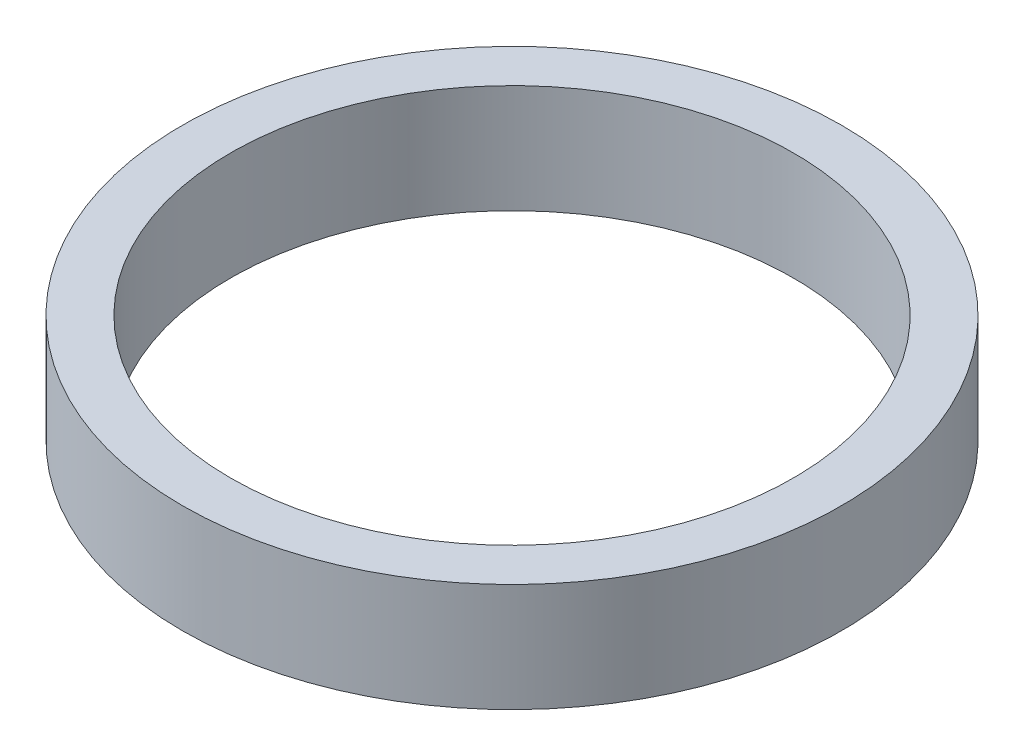
ISO-10303-21;
HEADER;
FILE_DESCRIPTION(('STEP AP214'),'2;1');
FILE_NAME('part.step','',(''),(''),'','','');
FILE_SCHEMA(('AUTOMOTIVE_DESIGN { 1 0 10303 214 1 1 1 1 }'));
ENDSEC;
DATA;
#1=APPLICATION_CONTEXT('core data for automotive mechanical design processes');
#2=APPLICATION_PROTOCOL_DEFINITION('international standard','automotive_design',2000,#1);
#3=PRODUCT_CONTEXT('',#1,'mechanical');
#4=PRODUCT('Part','Part','',(#3));
#5=PRODUCT_RELATED_PRODUCT_CATEGORY('part','',(#4));
#6=PRODUCT_DEFINITION_FORMATION('','',#4);
#7=PRODUCT_DEFINITION_CONTEXT('part definition',#1,'design');
#8=PRODUCT_DEFINITION('design','',#6,#7);
#9=PRODUCT_DEFINITION_SHAPE('','',#8);
#10=(LENGTH_UNIT() NAMED_UNIT(*) SI_UNIT(.MILLI.,.METRE.));
#11=(NAMED_UNIT(*) PLANE_ANGLE_UNIT() SI_UNIT($,.RADIAN.));
#12=(NAMED_UNIT(*) SI_UNIT($,.STERADIAN.) SOLID_ANGLE_UNIT());
#13=UNCERTAINTY_MEASURE_WITH_UNIT(LENGTH_MEASURE(1.E-05),#10,'distance_accuracy_value','');
#14=(GEOMETRIC_REPRESENTATION_CONTEXT(3) GLOBAL_UNCERTAINTY_ASSIGNED_CONTEXT((#13)) GLOBAL_UNIT_ASSIGNED_CONTEXT((#10,
#11,#12)) REPRESENTATION_CONTEXT('',''));
#15=CARTESIAN_POINT('',(0.,0.,0.));
#16=DIRECTION('',(0.,0.,1.));
#17=DIRECTION('',(1.,0.,0.));
#18=AXIS2_PLACEMENT_3D('',#15,#16,#17);
#19=CARTESIAN_POINT('',(0.,0.,0.));
#20=DIRECTION('',(0.,-1.,0.));
#21=DIRECTION('',(0.,0.,-1.));
#22=AXIS2_PLACEMENT_3D('',#19,#20,#21);
#23=PLANE('',#22);
#24=CARTESIAN_POINT('',(0.,0.,0.));
#25=DIRECTION('',(0.,-1.,0.));
#26=DIRECTION('',(0.,0.,-1.));
#27=AXIS2_PLACEMENT_3D('',#24,#25,#26);
#28=CIRCLE('',#27,12.6);
#29=CARTESIAN_POINT('',(0.,0.,12.6));
#30=VERTEX_POINT('',#29);
#31=EDGE_CURVE('E55',#30,#30,#28,.T.);
#32=ORIENTED_EDGE('',*,*,#31,.T.);
#33=EDGE_LOOP('',(#32));
#34=FACE_BOUND('',#33,.T.);
#35=CARTESIAN_POINT('',(0.,0.,0.));
#36=DIRECTION('',(0.,1.,0.));
#37=DIRECTION('',(0.,0.,1.));
#38=AXIS2_PLACEMENT_3D('',#35,#36,#37);
#39=CIRCLE('',#38,14.75);
#40=CARTESIAN_POINT('',(0.,0.,14.75));
#41=VERTEX_POINT('',#40);
#42=EDGE_CURVE('E10',#41,#41,#39,.T.);
#43=ORIENTED_EDGE('',*,*,#42,.T.);
#44=EDGE_LOOP('',(#43));
#45=FACE_BOUND('',#44,.T.);
#46=ADVANCED_FACE('F43',(#34,#45),#23,.F.);
#47=CARTESIAN_POINT('',(0.,0.,0.));
#48=DIRECTION('',(0.,1.,0.));
#49=DIRECTION('',(0.,0.,1.));
#50=AXIS2_PLACEMENT_3D('',#47,#48,#49);
#51=CYLINDRICAL_SURFACE('',#50,14.75);
#52=ORIENTED_EDGE('',*,*,#42,.F.);
#53=EDGE_LOOP('',(#52));
#54=FACE_BOUND('',#53,.T.);
#55=CARTESIAN_POINT('',(0.,-4.85,0.));
#56=DIRECTION('',(0.,1.,0.));
#57=DIRECTION('',(0.,0.,1.));
#58=AXIS2_PLACEMENT_3D('',#55,#56,#57);
#59=CIRCLE('',#58,14.75);
#60=CARTESIAN_POINT('',(0.,-4.85,14.75));
#61=VERTEX_POINT('',#60);
#62=EDGE_CURVE('E50',#61,#61,#59,.T.);
#63=ORIENTED_EDGE('',*,*,#62,.T.);
#64=EDGE_LOOP('',(#63));
#65=FACE_BOUND('',#64,.T.);
#66=ADVANCED_FACE('F77',(#54,#65),#51,.T.);
#67=CARTESIAN_POINT('',(14.75,-4.85,0.));
#68=DIRECTION('',(0.,1.,0.));
#69=DIRECTION('',(0.,0.,1.));
#70=AXIS2_PLACEMENT_3D('',#67,#68,#69);
#71=PLANE('',#70);
#72=CARTESIAN_POINT('',(0.,-4.85,0.));
#73=DIRECTION('',(0.,1.,0.));
#74=DIRECTION('',(0.,0.,1.));
#75=AXIS2_PLACEMENT_3D('',#72,#73,#74);
#76=CIRCLE('',#75,12.6);
#77=CARTESIAN_POINT('',(0.,-4.85,12.6));
#78=VERTEX_POINT('',#77);
#79=EDGE_CURVE('E60',#78,#78,#76,.T.);
#80=ORIENTED_EDGE('',*,*,#79,.T.);
#81=EDGE_LOOP('',(#80));
#82=FACE_BOUND('',#81,.T.);
#83=ORIENTED_EDGE('',*,*,#62,.F.);
#84=EDGE_LOOP('',(#83));
#85=FACE_BOUND('',#84,.T.);
#86=ADVANCED_FACE('F67',(#82,#85),#71,.F.);
#87=CARTESIAN_POINT('',(0.,-4.85,0.));
#88=DIRECTION('',(0.,1.,0.));
#89=DIRECTION('',(0.,0.,1.));
#90=AXIS2_PLACEMENT_3D('',#87,#88,#89);
#91=CYLINDRICAL_SURFACE('',#90,12.6);
#92=CARTESIAN_POINT('',(0.,-4.85,12.6));
#93=CARTESIAN_POINT('',(0.,-4.79947916666666,12.6));
#94=CARTESIAN_POINT('',(0.,-4.74895833333333,12.6));
#95=CARTESIAN_POINT('',(0.,-4.64791666666666,12.6));
#96=CARTESIAN_POINT('',(0.,-4.59739583333333,12.6));
#97=CARTESIAN_POINT('',(0.,-4.49635416666666,12.6));
#98=CARTESIAN_POINT('',(0.,-4.44583333333333,12.6));
#99=CARTESIAN_POINT('',(0.,-4.34479166666666,12.6));
#100=CARTESIAN_POINT('',(0.,-4.29427083333333,12.6));
#101=CARTESIAN_POINT('',(0.,-4.19322916666667,12.6));
#102=CARTESIAN_POINT('',(0.,-4.14270833333333,12.6));
#103=CARTESIAN_POINT('',(0.,-4.04166666666667,12.6));
#104=CARTESIAN_POINT('',(0.,-3.99114583333333,12.6));
#105=CARTESIAN_POINT('',(0.,-3.89010416666666,12.6));
#106=CARTESIAN_POINT('',(0.,-3.83958333333333,12.6));
#107=CARTESIAN_POINT('',(0.,-3.73854166666666,12.6));
#108=CARTESIAN_POINT('',(0.,-3.68802083333333,12.6));
#109=CARTESIAN_POINT('',(0.,-3.58697916666666,12.6));
#110=CARTESIAN_POINT('',(0.,-3.53645833333333,12.6));
#111=CARTESIAN_POINT('',(0.,-3.43541666666667,12.6));
#112=CARTESIAN_POINT('',(0.,-3.38489583333333,12.6));
#113=CARTESIAN_POINT('',(0.,-3.28385416666666,12.6));
#114=CARTESIAN_POINT('',(0.,-3.23333333333333,12.6));
#115=CARTESIAN_POINT('',(0.,-3.13229166666666,12.6));
#116=CARTESIAN_POINT('',(0.,-3.08177083333333,12.6));
#117=CARTESIAN_POINT('',(0.,-2.98072916666667,12.6));
#118=CARTESIAN_POINT('',(0.,-2.93020833333333,12.6));
#119=CARTESIAN_POINT('',(0.,-2.82916666666667,12.6));
#120=CARTESIAN_POINT('',(0.,-2.77864583333333,12.6));
#121=CARTESIAN_POINT('',(0.,-2.67760416666667,12.6));
#122=CARTESIAN_POINT('',(0.,-2.62708333333333,12.6));
#123=CARTESIAN_POINT('',(0.,-2.52604166666667,12.6));
#124=CARTESIAN_POINT('',(0.,-2.47552083333333,12.6));
#125=CARTESIAN_POINT('',(0.,-2.37447916666667,12.6));
#126=CARTESIAN_POINT('',(0.,-2.32395833333333,12.6));
#127=CARTESIAN_POINT('',(0.,-2.22291666666667,12.6));
#128=CARTESIAN_POINT('',(0.,-2.17239583333333,12.6));
#129=CARTESIAN_POINT('',(0.,-2.07135416666667,12.6));
#130=CARTESIAN_POINT('',(0.,-2.02083333333333,12.6));
#131=CARTESIAN_POINT('',(0.,-1.91979166666667,12.6));
#132=CARTESIAN_POINT('',(0.,-1.86927083333333,12.6));
#133=CARTESIAN_POINT('',(0.,-1.76822916666667,12.6));
#134=CARTESIAN_POINT('',(0.,-1.71770833333333,12.6));
#135=CARTESIAN_POINT('',(0.,-1.61666666666667,12.6));
#136=CARTESIAN_POINT('',(0.,-1.56614583333333,12.6));
#137=CARTESIAN_POINT('',(0.,-1.46510416666667,12.6));
#138=CARTESIAN_POINT('',(0.,-1.41458333333333,12.6));
#139=CARTESIAN_POINT('',(0.,-1.31354166666667,12.6));
#140=CARTESIAN_POINT('',(0.,-1.26302083333333,12.6));
#141=CARTESIAN_POINT('',(0.,-1.16197916666667,12.6));
#142=CARTESIAN_POINT('',(0.,-1.11145833333333,12.6));
#143=CARTESIAN_POINT('',(0.,-1.01041666666667,12.6));
#144=CARTESIAN_POINT('',(0.,-0.959895833333333,12.6));
#145=CARTESIAN_POINT('',(0.,-0.858854166666666,12.6));
#146=CARTESIAN_POINT('',(0.,-0.808333333333333,12.6));
#147=CARTESIAN_POINT('',(0.,-0.707291666666667,12.6));
#148=CARTESIAN_POINT('',(0.,-0.656770833333333,12.6));
#149=CARTESIAN_POINT('',(0.,-0.555729166666667,12.6));
#150=CARTESIAN_POINT('',(0.,-0.505208333333333,12.6));
#151=CARTESIAN_POINT('',(0.,-0.404166666666667,12.6));
#152=CARTESIAN_POINT('',(0.,-0.353645833333333,12.6));
#153=CARTESIAN_POINT('',(0.,-0.252604166666666,12.6));
#154=CARTESIAN_POINT('',(0.,-0.202083333333333,12.6));
#155=CARTESIAN_POINT('',(0.,-0.101041666666667,12.6));
#156=CARTESIAN_POINT('',(0.,-0.0505208333333332,12.6));
#157=CARTESIAN_POINT('',(0.,0.,12.6));
#158=B_SPLINE_CURVE_WITH_KNOTS('',3,(#92,#93,#94,#95,#96,#97,#98,#99,#100,#101,#102,#103,#104,
#105,#106,#107,#108,#109,#110,#111,#112,#113,#114,#115,#116,#117,#118,#119,#120,#121,#122,#123,
#124,#125,#126,#127,#128,#129,#130,#131,#132,#133,#134,#135,#136,#137,#138,#139,#140,#141,#142,
#143,#144,#145,#146,#147,#148,#149,#150,#151,#152,#153,#154,#155,#156,#157),.UNSPECIFIED.,.F.,
.F.,(4,2,2,2,2,2,2,2,2,2,2,2,2,2,2,2,2,2,2,2,2,2,2,2,2,2,2,2,2,2,2,2,4),(0.,0.151562500000001,
0.303125,0.4546875,0.60625,0.7578125,0.909375,1.0609375,1.2125,1.3640625,1.515625,1.6671875,
1.81875,1.9703125,2.121875,2.2734375,2.425,2.5765625,2.728125,2.8796875,3.03125,3.1828125,
3.334375,3.4859375,3.6375,3.7890625,3.940625,4.0921875,4.24375,4.3953125,4.546875,4.6984375,
4.85),.UNSPECIFIED.);
#159=EDGE_CURVE('BSEAM70',#78,#30,#158,.T.);
#160=ORIENTED_EDGE('',*,*,#79,.F.);
#161=ORIENTED_EDGE('',*,*,#31,.F.);
#162=ORIENTED_EDGE('',*,*,#159,.T.);
#163=ORIENTED_EDGE('',*,*,#159,.F.);
#164=EDGE_LOOP('',(#160,#162,#161,#163));
#165=FACE_BOUND('',#164,.T.);
#166=ADVANCED_FACE('F70',(#165),#91,.F.);
#167=CLOSED_SHELL('',(#46,#66,#86,#166));
#168=MANIFOLD_SOLID_BREP('B2',#167);
#169=ADVANCED_BREP_SHAPE_REPRESENTATION('',(#18,#168),#14);
#170=SHAPE_DEFINITION_REPRESENTATION(#9,#169);
ENDSEC;
END-ISO-10303-21;
